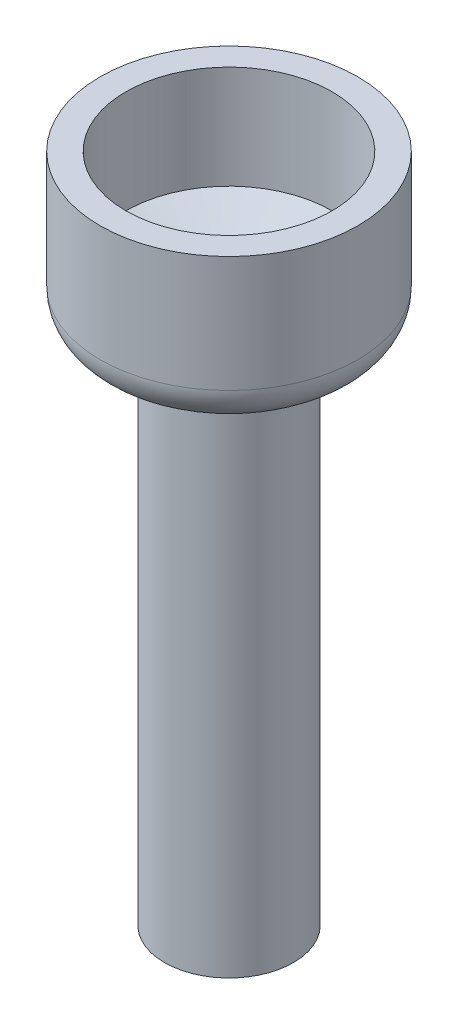
ISO-10303-21;
HEADER;
FILE_DESCRIPTION(('STEP AP214'),'2;1');
FILE_NAME('part.step','',(''),(''),'','','');
FILE_SCHEMA(('AUTOMOTIVE_DESIGN { 1 0 10303 214 1 1 1 1 }'));
ENDSEC;
DATA;
#1=APPLICATION_CONTEXT('core data for automotive mechanical design processes');
#2=APPLICATION_PROTOCOL_DEFINITION('international standard','automotive_design',2000,#1);
#3=PRODUCT_CONTEXT('',#1,'mechanical');
#4=PRODUCT('Part','Part','',(#3));
#5=PRODUCT_RELATED_PRODUCT_CATEGORY('part','',(#4));
#6=PRODUCT_DEFINITION_FORMATION('','',#4);
#7=PRODUCT_DEFINITION_CONTEXT('part definition',#1,'design');
#8=PRODUCT_DEFINITION('design','',#6,#7);
#9=PRODUCT_DEFINITION_SHAPE('','',#8);
#10=(LENGTH_UNIT() NAMED_UNIT(*) SI_UNIT(.MILLI.,.METRE.));
#11=(NAMED_UNIT(*) PLANE_ANGLE_UNIT() SI_UNIT($,.RADIAN.));
#12=(NAMED_UNIT(*) SI_UNIT($,.STERADIAN.) SOLID_ANGLE_UNIT());
#13=UNCERTAINTY_MEASURE_WITH_UNIT(LENGTH_MEASURE(1.E-05),#10,'distance_accuracy_value','');
#14=(GEOMETRIC_REPRESENTATION_CONTEXT(3) GLOBAL_UNCERTAINTY_ASSIGNED_CONTEXT((#13)) GLOBAL_UNIT_ASSIGNED_CONTEXT((#10,
#11,#12)) REPRESENTATION_CONTEXT('',''));
#15=CARTESIAN_POINT('',(0.,0.,0.));
#16=DIRECTION('',(0.,0.,1.));
#17=DIRECTION('',(1.,0.,0.));
#18=AXIS2_PLACEMENT_3D('',#15,#16,#17);
#19=CARTESIAN_POINT('',(0.,1.5,0.));
#20=DIRECTION('',(0.,1.,0.));
#21=DIRECTION('',(0.,0.,1.));
#22=AXIS2_PLACEMENT_3D('',#19,#20,#21);
#23=TOROIDAL_SURFACE('',#22,3.5,1.5);
#24=CARTESIAN_POINT('',(0.,0.,0.));
#25=DIRECTION('',(0.,1.,0.));
#26=DIRECTION('',(0.,0.,1.));
#27=AXIS2_PLACEMENT_3D('',#24,#25,#26);
#28=CIRCLE('',#27,3.5);
#29=CARTESIAN_POINT('',(0.,0.,3.5));
#30=VERTEX_POINT('',#29);
#31=EDGE_CURVE('E10',#30,#30,#28,.T.);
#32=ORIENTED_EDGE('',*,*,#31,.T.);
#33=EDGE_LOOP('',(#32));
#34=FACE_BOUND('',#33,.T.);
#35=CARTESIAN_POINT('',(0.,1.5,0.));
#36=DIRECTION('',(0.,1.,0.));
#37=DIRECTION('',(0.,0.,1.));
#38=AXIS2_PLACEMENT_3D('',#35,#36,#37);
#39=CIRCLE('',#38,5.);
#40=CARTESIAN_POINT('',(0.,1.5,5.));
#41=VERTEX_POINT('',#40);
#42=EDGE_CURVE('E65',#41,#41,#39,.T.);
#43=ORIENTED_EDGE('',*,*,#42,.F.);
#44=EDGE_LOOP('',(#43));
#45=FACE_BOUND('',#44,.T.);
#46=ADVANCED_FACE('F34',(#34,#45),#23,.T.);
#47=CARTESIAN_POINT('',(-3.5,0.,0.));
#48=DIRECTION('',(0.,-1.,0.));
#49=DIRECTION('',(0.,0.,-1.));
#50=AXIS2_PLACEMENT_3D('',#47,#48,#49);
#51=PLANE('',#50);
#52=CARTESIAN_POINT('',(0.,0.,0.));
#53=DIRECTION('',(0.,1.,0.));
#54=DIRECTION('',(0.,0.,1.));
#55=AXIS2_PLACEMENT_3D('',#52,#53,#54);
#56=CIRCLE('',#55,2.5);
#57=CARTESIAN_POINT('',(0.,0.,2.5));
#58=VERTEX_POINT('',#57);
#59=EDGE_CURVE('E40',#58,#58,#56,.T.);
#60=ORIENTED_EDGE('',*,*,#59,.T.);
#61=EDGE_LOOP('',(#60));
#62=FACE_BOUND('',#61,.T.);
#63=ORIENTED_EDGE('',*,*,#31,.F.);
#64=EDGE_LOOP('',(#63));
#65=FACE_BOUND('',#64,.T.);
#66=ADVANCED_FACE('F73',(#62,#65),#51,.T.);
#67=CARTESIAN_POINT('',(0.,0.,0.));
#68=DIRECTION('',(0.,1.,0.));
#69=DIRECTION('',(0.,0.,1.));
#70=AXIS2_PLACEMENT_3D('',#67,#68,#69);
#71=CYLINDRICAL_SURFACE('',#70,2.5);
#72=CARTESIAN_POINT('',(0.,-20.,0.));
#73=DIRECTION('',(0.,1.,0.));
#74=DIRECTION('',(0.,0.,1.));
#75=AXIS2_PLACEMENT_3D('',#72,#73,#74);
#76=CIRCLE('',#75,2.5);
#77=CARTESIAN_POINT('',(0.,-20.,2.5));
#78=VERTEX_POINT('',#77);
#79=EDGE_CURVE('E44',#78,#78,#76,.T.);
#80=ORIENTED_EDGE('',*,*,#79,.T.);
#81=EDGE_LOOP('',(#80));
#82=FACE_BOUND('',#81,.T.);
#83=ORIENTED_EDGE('',*,*,#59,.F.);
#84=EDGE_LOOP('',(#83));
#85=FACE_BOUND('',#84,.T.);
#86=ADVANCED_FACE('F77',(#82,#85),#71,.T.);
#87=CARTESIAN_POINT('',(-2.5,-20.,0.));
#88=DIRECTION('',(0.,-1.,0.));
#89=DIRECTION('',(0.,0.,-1.));
#90=AXIS2_PLACEMENT_3D('',#87,#88,#89);
#91=PLANE('',#90);
#92=CARTESIAN_POINT('',(0.,-20.,0.));
#93=DIRECTION('',(0.,1.,0.));
#94=DIRECTION('',(0.,0.,1.));
#95=AXIS2_PLACEMENT_3D('',#92,#93,#94);
#96=CIRCLE('',#95,0.75);
#97=CARTESIAN_POINT('',(0.,-20.,0.75));
#98=VERTEX_POINT('',#97);
#99=EDGE_CURVE('E48',#98,#98,#96,.T.);
#100=ORIENTED_EDGE('',*,*,#99,.T.);
#101=EDGE_LOOP('',(#100));
#102=FACE_BOUND('',#101,.T.);
#103=ORIENTED_EDGE('',*,*,#79,.F.);
#104=EDGE_LOOP('',(#103));
#105=FACE_BOUND('',#104,.T.);
#106=ADVANCED_FACE('F81',(#102,#105),#91,.T.);
#107=CARTESIAN_POINT('',(0.,0.,0.));
#108=DIRECTION('',(0.,1.,0.));
#109=DIRECTION('',(0.,0.,1.));
#110=AXIS2_PLACEMENT_3D('',#107,#108,#109);
#111=CYLINDRICAL_SURFACE('',#110,0.749999999999999);
#112=CARTESIAN_POINT('',(0.,1.,0.));
#113=DIRECTION('',(0.,1.,0.));
#114=DIRECTION('',(0.,0.,1.));
#115=AXIS2_PLACEMENT_3D('',#112,#113,#114);
#116=CIRCLE('',#115,0.749999999999998);
#117=CARTESIAN_POINT('',(0.,1.,0.749999999999997));
#118=VERTEX_POINT('',#117);
#119=EDGE_CURVE('E53',#118,#118,#116,.T.);
#120=ORIENTED_EDGE('',*,*,#119,.T.);
#121=EDGE_LOOP('',(#120));
#122=FACE_BOUND('',#121,.T.);
#123=ORIENTED_EDGE('',*,*,#99,.F.);
#124=EDGE_LOOP('',(#123));
#125=FACE_BOUND('',#124,.T.);
#126=ADVANCED_FACE('F88',(#122,#125),#111,.F.);
#127=CARTESIAN_POINT('',(0.,1.,0.));
#128=DIRECTION('',(0.,1.,0.));
#129=DIRECTION('',(0.,0.,1.));
#130=AXIS2_PLACEMENT_3D('',#127,#128,#129);
#131=CONICAL_SURFACE('',#130,0.749999999999998,1.27229739520872);
#132=CARTESIAN_POINT('',(0.,2.,0.));
#133=DIRECTION('',(0.,1.,0.));
#134=DIRECTION('',(0.,0.,1.));
#135=AXIS2_PLACEMENT_3D('',#132,#133,#134);
#136=CIRCLE('',#135,4.);
#137=CARTESIAN_POINT('',(0.,2.,4.));
#138=VERTEX_POINT('',#137);
#139=EDGE_CURVE('E56',#138,#138,#136,.T.);
#140=CARTESIAN_POINT('',(0.,2.,4.));
#141=CARTESIAN_POINT('',(0.,1.98958333333333,3.96614583333333));
#142=CARTESIAN_POINT('',(0.,1.97916666666667,3.93229166666666));
#143=CARTESIAN_POINT('',(0.,1.95833333333333,3.86458333333333));
#144=CARTESIAN_POINT('',(0.,1.94791666666667,3.83072916666667));
#145=CARTESIAN_POINT('',(0.,1.92708333333333,3.76302083333333));
#146=CARTESIAN_POINT('',(0.,1.91666666666667,3.72916666666667));
#147=CARTESIAN_POINT('',(0.,1.89583333333333,3.66145833333333));
#148=CARTESIAN_POINT('',(0.,1.88541666666667,3.62760416666667));
#149=CARTESIAN_POINT('',(0.,1.86458333333333,3.55989583333333));
#150=CARTESIAN_POINT('',(0.,1.85416666666667,3.52604166666667));
#151=CARTESIAN_POINT('',(0.,1.83333333333333,3.45833333333333));
#152=CARTESIAN_POINT('',(0.,1.82291666666667,3.42447916666667));
#153=CARTESIAN_POINT('',(0.,1.80208333333333,3.35677083333333));
#154=CARTESIAN_POINT('',(0.,1.79166666666667,3.32291666666667));
#155=CARTESIAN_POINT('',(0.,1.77083333333333,3.25520833333333));
#156=CARTESIAN_POINT('',(0.,1.76041666666667,3.22135416666666));
#157=CARTESIAN_POINT('',(0.,1.73958333333333,3.15364583333333));
#158=CARTESIAN_POINT('',(0.,1.72916666666667,3.11979166666666));
#159=CARTESIAN_POINT('',(0.,1.70833333333333,3.05208333333333));
#160=CARTESIAN_POINT('',(0.,1.69791666666667,3.01822916666666));
#161=CARTESIAN_POINT('',(0.,1.67708333333333,2.95052083333333));
#162=CARTESIAN_POINT('',(0.,1.66666666666667,2.91666666666666));
#163=CARTESIAN_POINT('',(0.,1.64583333333333,2.84895833333333));
#164=CARTESIAN_POINT('',(0.,1.63541666666667,2.81510416666667));
#165=CARTESIAN_POINT('',(0.,1.61458333333333,2.74739583333333));
#166=CARTESIAN_POINT('',(0.,1.60416666666667,2.71354166666666));
#167=CARTESIAN_POINT('',(0.,1.58333333333333,2.64583333333333));
#168=CARTESIAN_POINT('',(0.,1.57291666666667,2.61197916666666));
#169=CARTESIAN_POINT('',(0.,1.55208333333333,2.54427083333333));
#170=CARTESIAN_POINT('',(0.,1.54166666666667,2.51041666666666));
#171=CARTESIAN_POINT('',(0.,1.52083333333333,2.44270833333333));
#172=CARTESIAN_POINT('',(0.,1.51041666666667,2.40885416666666));
#173=CARTESIAN_POINT('',(0.,1.48958333333333,2.34114583333333));
#174=CARTESIAN_POINT('',(0.,1.47916666666667,2.30729166666666));
#175=CARTESIAN_POINT('',(0.,1.45833333333333,2.23958333333333));
#176=CARTESIAN_POINT('',(0.,1.44791666666667,2.20572916666666));
#177=CARTESIAN_POINT('',(0.,1.42708333333333,2.13802083333333));
#178=CARTESIAN_POINT('',(0.,1.41666666666667,2.10416666666666));
#179=CARTESIAN_POINT('',(0.,1.39583333333333,2.03645833333333));
#180=CARTESIAN_POINT('',(0.,1.38541666666667,2.00260416666666));
#181=CARTESIAN_POINT('',(0.,1.36458333333333,1.93489583333333));
#182=CARTESIAN_POINT('',(0.,1.35416666666667,1.90104166666666));
#183=CARTESIAN_POINT('',(0.,1.33333333333333,1.83333333333333));
#184=CARTESIAN_POINT('',(0.,1.32291666666667,1.79947916666666));
#185=CARTESIAN_POINT('',(0.,1.30208333333333,1.73177083333333));
#186=CARTESIAN_POINT('',(0.,1.29166666666667,1.69791666666666));
#187=CARTESIAN_POINT('',(0.,1.27083333333333,1.63020833333333));
#188=CARTESIAN_POINT('',(0.,1.26041666666667,1.59635416666666));
#189=CARTESIAN_POINT('',(0.,1.23958333333333,1.52864583333333));
#190=CARTESIAN_POINT('',(0.,1.22916666666667,1.49479166666666));
#191=CARTESIAN_POINT('',(0.,1.20833333333333,1.42708333333333));
#192=CARTESIAN_POINT('',(0.,1.19791666666667,1.39322916666666));
#193=CARTESIAN_POINT('',(0.,1.17708333333333,1.32552083333333));
#194=CARTESIAN_POINT('',(0.,1.16666666666667,1.29166666666666));
#195=CARTESIAN_POINT('',(0.,1.14583333333333,1.22395833333333));
#196=CARTESIAN_POINT('',(0.,1.13541666666667,1.19010416666666));
#197=CARTESIAN_POINT('',(0.,1.11458333333333,1.12239583333333));
#198=CARTESIAN_POINT('',(0.,1.10416666666667,1.08854166666666));
#199=CARTESIAN_POINT('',(0.,1.08333333333333,1.02083333333333));
#200=CARTESIAN_POINT('',(0.,1.07291666666667,0.986979166666664));
#201=CARTESIAN_POINT('',(0.,1.05208333333333,0.91927083333333));
#202=CARTESIAN_POINT('',(0.,1.04166666666667,0.885416666666664));
#203=CARTESIAN_POINT('',(0.,1.02083333333333,0.81770833333333));
#204=CARTESIAN_POINT('',(0.,1.01041666666667,0.783854166666664));
#205=CARTESIAN_POINT('',(0.,1.,0.749999999999997));
#206=B_SPLINE_CURVE_WITH_KNOTS('',3,(#140,#141,#142,#143,#144,#145,#146,#147,#148,#149,#150,
#151,#152,#153,#154,#155,#156,#157,#158,#159,#160,#161,#162,#163,#164,#165,#166,#167,#168,#169,
#170,#171,#172,#173,#174,#175,#176,#177,#178,#179,#180,#181,#182,#183,#184,#185,#186,#187,#188,
#189,#190,#191,#192,#193,#194,#195,#196,#197,#198,#199,#200,#201,#202,#203,#204,#205),
.UNSPECIFIED.,.F.,.F.,(4,2,2,2,2,2,2,2,2,2,2,2,2,2,2,2,2,2,2,2,2,2,2,2,2,2,2,2,2,2,2,2,4),(0.,
0.106261488349496,0.212522976698991,0.318784465048487,0.425045953397983,0.531307441747478,
0.637568930096974,0.74383041844647,0.850091906795966,0.956353395145461,1.06261488349496,
1.16887637184445,1.27513786019395,1.38139934854344,1.48766083689294,1.59392232524244,
1.70018381359193,1.80644530194143,1.91270679029092,2.01896827864042,2.12522976698991,
2.23149125533941,2.33775274368891,2.4440142320384,2.5502757203879,2.65653720873739,
2.76279869708689,2.86906018543638,2.97532167378588,3.08158316213537,3.18784465048487,
3.29410613883437,3.40036762718386),.UNSPECIFIED.);
#207=EDGE_CURVE('BSEAM92',#138,#118,#206,.T.);
#208=ORIENTED_EDGE('',*,*,#139,.T.);
#209=ORIENTED_EDGE('',*,*,#119,.F.);
#210=ORIENTED_EDGE('',*,*,#207,.T.);
#211=ORIENTED_EDGE('',*,*,#207,.F.);
#212=EDGE_LOOP('',(#208,#210,#209,#211));
#213=FACE_BOUND('',#212,.T.);
#214=ADVANCED_FACE('F92',(#213),#131,.F.);
#215=CARTESIAN_POINT('',(0.,0.,0.));
#216=DIRECTION('',(0.,1.,0.));
#217=DIRECTION('',(0.,0.,1.));
#218=AXIS2_PLACEMENT_3D('',#215,#216,#217);
#219=CYLINDRICAL_SURFACE('',#218,4.);
#220=CARTESIAN_POINT('',(0.,6.,0.));
#221=DIRECTION('',(0.,1.,0.));
#222=DIRECTION('',(0.,0.,1.));
#223=AXIS2_PLACEMENT_3D('',#220,#221,#222);
#224=CIRCLE('',#223,4.);
#225=CARTESIAN_POINT('',(0.,6.,4.));
#226=VERTEX_POINT('',#225);
#227=EDGE_CURVE('E59',#226,#226,#224,.T.);
#228=ORIENTED_EDGE('',*,*,#227,.T.);
#229=EDGE_LOOP('',(#228));
#230=FACE_BOUND('',#229,.T.);
#231=ORIENTED_EDGE('',*,*,#139,.F.);
#232=EDGE_LOOP('',(#231));
#233=FACE_BOUND('',#232,.T.);
#234=ADVANCED_FACE('F96',(#230,#233),#219,.F.);
#235=CARTESIAN_POINT('',(-4.,6.,0.));
#236=DIRECTION('',(0.,1.,0.));
#237=DIRECTION('',(0.,0.,1.));
#238=AXIS2_PLACEMENT_3D('',#235,#236,#237);
#239=PLANE('',#238);
#240=CARTESIAN_POINT('',(0.,6.,0.));
#241=DIRECTION('',(0.,1.,0.));
#242=DIRECTION('',(0.,0.,1.));
#243=AXIS2_PLACEMENT_3D('',#240,#241,#242);
#244=CIRCLE('',#243,5.);
#245=CARTESIAN_POINT('',(0.,6.,5.));
#246=VERTEX_POINT('',#245);
#247=EDGE_CURVE('E62',#246,#246,#244,.T.);
#248=ORIENTED_EDGE('',*,*,#247,.T.);
#249=EDGE_LOOP('',(#248));
#250=FACE_BOUND('',#249,.T.);
#251=ORIENTED_EDGE('',*,*,#227,.F.);
#252=EDGE_LOOP('',(#251));
#253=FACE_BOUND('',#252,.T.);
#254=ADVANCED_FACE('F100',(#250,#253),#239,.T.);
#255=CARTESIAN_POINT('',(0.,0.,0.));
#256=DIRECTION('',(0.,1.,0.));
#257=DIRECTION('',(0.,0.,1.));
#258=AXIS2_PLACEMENT_3D('',#255,#256,#257);
#259=CYLINDRICAL_SURFACE('',#258,5.);
#260=ORIENTED_EDGE('',*,*,#42,.T.);
#261=EDGE_LOOP('',(#260));
#262=FACE_BOUND('',#261,.T.);
#263=ORIENTED_EDGE('',*,*,#247,.F.);
#264=EDGE_LOOP('',(#263));
#265=FACE_BOUND('',#264,.T.);
#266=ADVANCED_FACE('F69',(#262,#265),#259,.T.);
#267=CLOSED_SHELL('',(#46,#66,#86,#106,#126,#214,#234,#254,#266));
#268=MANIFOLD_SOLID_BREP('B2',#267);
#269=ADVANCED_BREP_SHAPE_REPRESENTATION('',(#18,#268),#14);
#270=SHAPE_DEFINITION_REPRESENTATION(#9,#269);
ENDSEC;
END-ISO-10303-21;
